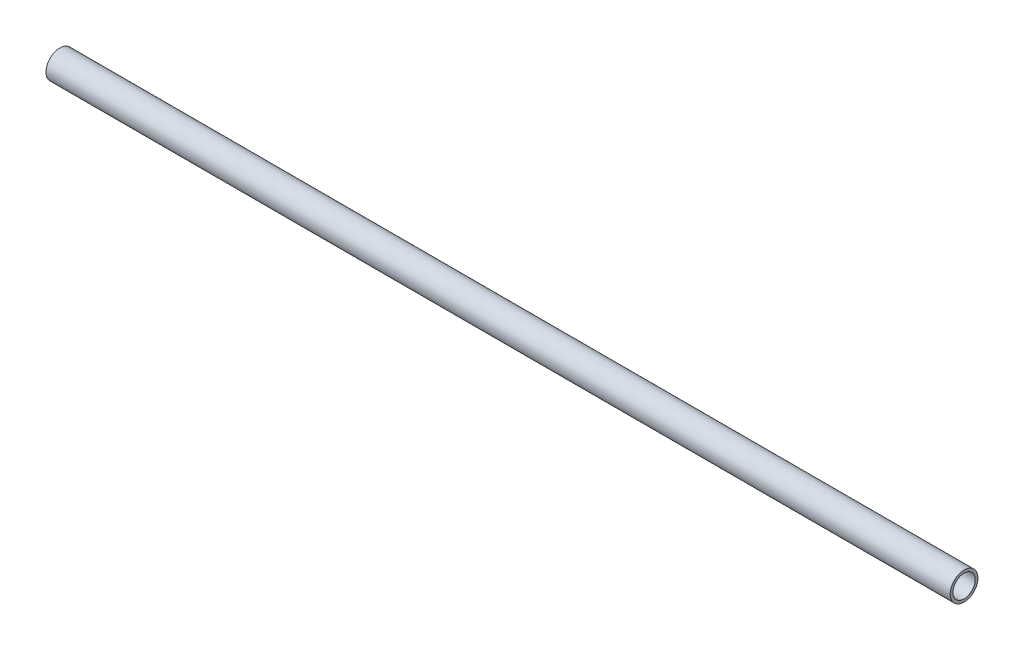
ISO-10303-21;
HEADER;
FILE_DESCRIPTION(('STEP AP214'),'2;1');
FILE_NAME('part.step','',(''),(''),'','','');
FILE_SCHEMA(('AUTOMOTIVE_DESIGN { 1 0 10303 214 1 1 1 1 }'));
ENDSEC;
DATA;
#1=APPLICATION_CONTEXT('core data for automotive mechanical design processes');
#2=APPLICATION_PROTOCOL_DEFINITION('international standard','automotive_design',2000,#1);
#3=PRODUCT_CONTEXT('',#1,'mechanical');
#4=PRODUCT('Part','Part','',(#3));
#5=PRODUCT_RELATED_PRODUCT_CATEGORY('part','',(#4));
#6=PRODUCT_DEFINITION_FORMATION('','',#4);
#7=PRODUCT_DEFINITION_CONTEXT('part definition',#1,'design');
#8=PRODUCT_DEFINITION('design','',#6,#7);
#9=PRODUCT_DEFINITION_SHAPE('','',#8);
#10=(LENGTH_UNIT() NAMED_UNIT(*) SI_UNIT(.MILLI.,.METRE.));
#11=(NAMED_UNIT(*) PLANE_ANGLE_UNIT() SI_UNIT($,.RADIAN.));
#12=(NAMED_UNIT(*) SI_UNIT($,.STERADIAN.) SOLID_ANGLE_UNIT());
#13=UNCERTAINTY_MEASURE_WITH_UNIT(LENGTH_MEASURE(1.E-05),#10,'distance_accuracy_value','');
#14=(GEOMETRIC_REPRESENTATION_CONTEXT(3) GLOBAL_UNCERTAINTY_ASSIGNED_CONTEXT((#13)) GLOBAL_UNIT_ASSIGNED_CONTEXT((#10,
#11,#12)) REPRESENTATION_CONTEXT('',''));
#15=CARTESIAN_POINT('',(0.,0.,0.));
#16=DIRECTION('',(0.,0.,1.));
#17=DIRECTION('',(1.,0.,0.));
#18=AXIS2_PLACEMENT_3D('',#15,#16,#17);
#19=CARTESIAN_POINT('',(-162.5,0.,0.));
#20=DIRECTION('',(-1.,0.,0.));
#21=DIRECTION('',(0.,0.,1.));
#22=AXIS2_PLACEMENT_3D('',#19,#20,#21);
#23=CYLINDRICAL_SURFACE('',#22,4.);
#24=CARTESIAN_POINT('',(-162.5,0.,0.));
#25=DIRECTION('',(-1.,0.,0.));
#26=DIRECTION('',(0.,0.,1.));
#27=AXIS2_PLACEMENT_3D('',#24,#25,#26);
#28=CIRCLE('',#27,4.);
#29=CARTESIAN_POINT('',(-162.5,0.,4.00000000000003));
#30=VERTEX_POINT('',#29);
#31=EDGE_CURVE('E26',#30,#30,#28,.T.);
#32=ORIENTED_EDGE('',*,*,#31,.T.);
#33=EDGE_LOOP('',(#32));
#34=FACE_BOUND('',#33,.T.);
#35=CARTESIAN_POINT('',(162.5,0.,0.));
#36=DIRECTION('',(-1.,0.,0.));
#37=DIRECTION('',(0.,0.,1.));
#38=AXIS2_PLACEMENT_3D('',#35,#36,#37);
#39=CIRCLE('',#38,4.);
#40=CARTESIAN_POINT('',(162.5,0.,3.99999999999997));
#41=VERTEX_POINT('',#40);
#42=EDGE_CURVE('E17',#41,#41,#39,.T.);
#43=ORIENTED_EDGE('',*,*,#42,.F.);
#44=EDGE_LOOP('',(#43));
#45=FACE_BOUND('',#44,.T.);
#46=ADVANCED_FACE('F14',(#34,#45),#23,.F.);
#47=CARTESIAN_POINT('',(162.5,0.,0.));
#48=DIRECTION('',(1.,0.,0.));
#49=DIRECTION('',(0.,0.,-1.));
#50=AXIS2_PLACEMENT_3D('',#47,#48,#49);
#51=PLANE('',#50);
#52=ORIENTED_EDGE('',*,*,#42,.T.);
#53=EDGE_LOOP('',(#52));
#54=FACE_BOUND('',#53,.T.);
#55=CARTESIAN_POINT('',(162.5,0.,0.));
#56=DIRECTION('',(1.,0.,0.));
#57=DIRECTION('',(0.,0.,-1.));
#58=AXIS2_PLACEMENT_3D('',#55,#56,#57);
#59=CIRCLE('',#58,5.);
#60=CARTESIAN_POINT('',(162.5,0.,-5.00000000000003));
#61=VERTEX_POINT('',#60);
#62=EDGE_CURVE('E21',#61,#61,#59,.F.);
#63=ORIENTED_EDGE('',*,*,#62,.F.);
#64=EDGE_LOOP('',(#63));
#65=FACE_BOUND('',#64,.T.);
#66=ADVANCED_FACE('F34',(#54,#65),#51,.T.);
#67=CARTESIAN_POINT('',(-162.5,0.,0.));
#68=DIRECTION('',(1.,0.,0.));
#69=DIRECTION('',(0.,0.,-1.));
#70=AXIS2_PLACEMENT_3D('',#67,#68,#69);
#71=PLANE('',#70);
#72=ORIENTED_EDGE('',*,*,#31,.F.);
#73=EDGE_LOOP('',(#72));
#74=FACE_BOUND('',#73,.T.);
#75=CARTESIAN_POINT('',(-162.5,0.,0.));
#76=DIRECTION('',(1.,0.,0.));
#77=DIRECTION('',(0.,0.,-1.));
#78=AXIS2_PLACEMENT_3D('',#75,#76,#77);
#79=CIRCLE('',#78,5.);
#80=CARTESIAN_POINT('',(-162.5,0.,-4.99999999999997));
#81=VERTEX_POINT('',#80);
#82=EDGE_CURVE('E10',#81,#81,#79,.T.);
#83=ORIENTED_EDGE('',*,*,#82,.F.);
#84=EDGE_LOOP('',(#83));
#85=FACE_BOUND('',#84,.T.);
#86=ADVANCED_FACE('F42',(#74,#85),#71,.F.);
#87=CARTESIAN_POINT('',(-162.5,0.,0.));
#88=DIRECTION('',(1.,0.,0.));
#89=DIRECTION('',(0.,0.,-1.));
#90=AXIS2_PLACEMENT_3D('',#87,#88,#89);
#91=CYLINDRICAL_SURFACE('',#90,5.);
#92=ORIENTED_EDGE('',*,*,#82,.T.);
#93=EDGE_LOOP('',(#92));
#94=FACE_BOUND('',#93,.T.);
#95=ORIENTED_EDGE('',*,*,#62,.T.);
#96=EDGE_LOOP('',(#95));
#97=FACE_BOUND('',#96,.T.);
#98=ADVANCED_FACE('F43',(#94,#97),#91,.T.);
#99=CLOSED_SHELL('',(#46,#66,#86,#98));
#100=MANIFOLD_SOLID_BREP('B1',#99);
#101=ADVANCED_BREP_SHAPE_REPRESENTATION('',(#18,#100),#14);
#102=SHAPE_DEFINITION_REPRESENTATION(#9,#101);
ENDSEC;
END-ISO-10303-21;
